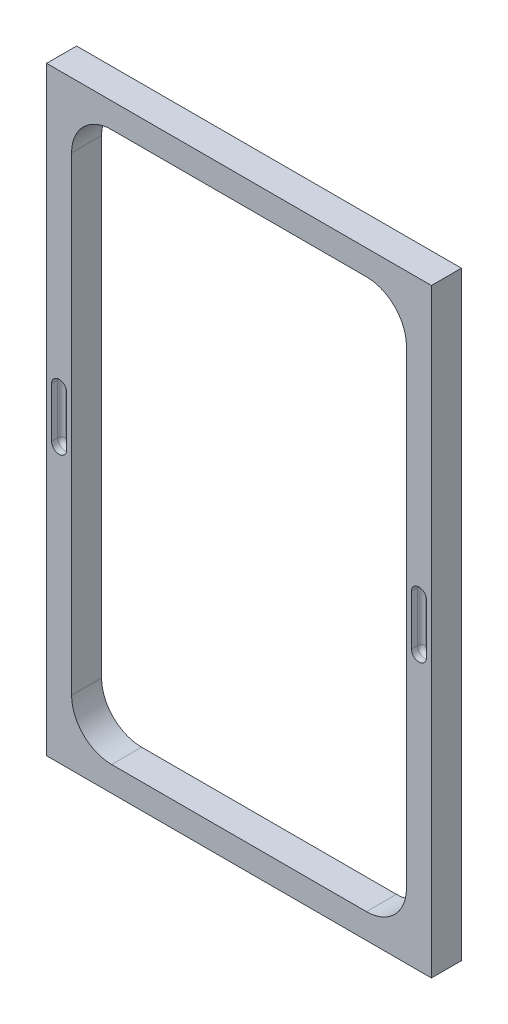
ISO-10303-21;
HEADER;
FILE_DESCRIPTION(('STEP AP214'),'2;1');
FILE_NAME('part.step','',(''),(''),'','','');
FILE_SCHEMA(('AUTOMOTIVE_DESIGN { 1 0 10303 214 1 1 1 1 }'));
ENDSEC;
DATA;
#1=APPLICATION_CONTEXT('core data for automotive mechanical design processes');
#2=APPLICATION_PROTOCOL_DEFINITION('international standard','automotive_design',2000,#1);
#3=PRODUCT_CONTEXT('',#1,'mechanical');
#4=PRODUCT('Part','Part','',(#3));
#5=PRODUCT_RELATED_PRODUCT_CATEGORY('part','',(#4));
#6=PRODUCT_DEFINITION_FORMATION('','',#4);
#7=PRODUCT_DEFINITION_CONTEXT('part definition',#1,'design');
#8=PRODUCT_DEFINITION('design','',#6,#7);
#9=PRODUCT_DEFINITION_SHAPE('','',#8);
#10=(LENGTH_UNIT() NAMED_UNIT(*) SI_UNIT(.MILLI.,.METRE.));
#11=(NAMED_UNIT(*) PLANE_ANGLE_UNIT() SI_UNIT($,.RADIAN.));
#12=(NAMED_UNIT(*) SI_UNIT($,.STERADIAN.) SOLID_ANGLE_UNIT());
#13=UNCERTAINTY_MEASURE_WITH_UNIT(LENGTH_MEASURE(1.E-05),#10,'distance_accuracy_value','');
#14=(GEOMETRIC_REPRESENTATION_CONTEXT(3) GLOBAL_UNCERTAINTY_ASSIGNED_CONTEXT((#13)) GLOBAL_UNIT_ASSIGNED_CONTEXT((#10,
#11,#12)) REPRESENTATION_CONTEXT('',''));
#15=CARTESIAN_POINT('',(0.,0.,0.));
#16=DIRECTION('',(0.,0.,1.));
#17=DIRECTION('',(1.,0.,0.));
#18=AXIS2_PLACEMENT_3D('',#15,#16,#17);
#19=CARTESIAN_POINT('',(0.,0.,76.2));
#20=DIRECTION('',(0.,0.,-1.));
#21=DIRECTION('',(-1.,0.,0.));
#22=AXIS2_PLACEMENT_3D('',#19,#20,#21);
#23=PLANE('',#22);
#24=DIRECTION('',(0.,-1.,0.));
#25=VECTOR('',#24,1.);
#26=CARTESIAN_POINT('',(12.7,825.5,76.2));
#27=LINE('',#26,#25);
#28=CARTESIAN_POINT('',(12.7,825.5,76.2));
#29=VERTEX_POINT('',#28);
#30=CARTESIAN_POINT('',(12.6999999999999,698.5,76.2));
#31=VERTEX_POINT('',#30);
#32=EDGE_CURVE('E202',#29,#31,#27,.T.);
#33=ORIENTED_EDGE('',*,*,#32,.F.);
#34=CARTESIAN_POINT('',(31.7499999999999,825.5,76.2));
#35=DIRECTION('',(0.,0.,1.));
#36=DIRECTION('',(1.,0.,0.));
#37=AXIS2_PLACEMENT_3D('',#34,#35,#36);
#38=CIRCLE('',#37,19.05);
#39=CARTESIAN_POINT('',(50.8,825.5,76.2));
#40=VERTEX_POINT('',#39);
#41=EDGE_CURVE('E207',#40,#29,#38,.T.);
#42=ORIENTED_EDGE('',*,*,#41,.F.);
#43=DIRECTION('',(0.,1.,0.));
#44=VECTOR('',#43,1.);
#45=CARTESIAN_POINT('',(50.8,825.5,76.2));
#46=LINE('',#45,#44);
#47=CARTESIAN_POINT('',(50.8,698.5,76.2));
#48=VERTEX_POINT('',#47);
#49=EDGE_CURVE('E211',#48,#40,#46,.T.);
#50=ORIENTED_EDGE('',*,*,#49,.F.);
#51=CARTESIAN_POINT('',(31.7499999999999,698.5,76.2));
#52=DIRECTION('',(0.,0.,1.));
#53=DIRECTION('',(1.,0.,0.));
#54=AXIS2_PLACEMENT_3D('',#51,#52,#53);
#55=CIRCLE('',#54,19.05);
#56=EDGE_CURVE('E196',#31,#48,#55,.T.);
#57=ORIENTED_EDGE('',*,*,#56,.F.);
#58=EDGE_LOOP('',(#33,#42,#50,#57));
#59=FACE_BOUND('',#58,.T.);
#60=DIRECTION('',(0.,-1.,0.));
#61=VECTOR('',#60,1.);
#62=CARTESIAN_POINT('',(927.1,825.5,76.2));
#63=LINE('',#62,#61);
#64=CARTESIAN_POINT('',(927.1,825.5,76.2));
#65=VERTEX_POINT('',#64);
#66=CARTESIAN_POINT('',(927.1,698.5,76.2));
#67=VERTEX_POINT('',#66);
#68=EDGE_CURVE('E224',#65,#67,#63,.T.);
#69=ORIENTED_EDGE('',*,*,#68,.F.);
#70=CARTESIAN_POINT('',(946.15,825.5,76.2));
#71=DIRECTION('',(0.,0.,1.));
#72=DIRECTION('',(-1.,0.,0.));
#73=AXIS2_PLACEMENT_3D('',#70,#71,#72);
#74=CIRCLE('',#73,19.0500000000001);
#75=CARTESIAN_POINT('',(965.2,825.5,76.2));
#76=VERTEX_POINT('',#75);
#77=EDGE_CURVE('E221',#76,#65,#74,.T.);
#78=ORIENTED_EDGE('',*,*,#77,.F.);
#79=DIRECTION('',(0.,1.,0.));
#80=VECTOR('',#79,1.);
#81=CARTESIAN_POINT('',(965.2,825.5,76.2));
#82=LINE('',#81,#80);
#83=CARTESIAN_POINT('',(965.2,698.5,76.2));
#84=VERTEX_POINT('',#83);
#85=EDGE_CURVE('E231',#84,#76,#82,.T.);
#86=ORIENTED_EDGE('',*,*,#85,.F.);
#87=CARTESIAN_POINT('',(946.15,698.5,76.2));
#88=DIRECTION('',(0.,0.,1.));
#89=DIRECTION('',(-1.,0.,0.));
#90=AXIS2_PLACEMENT_3D('',#87,#88,#89);
#91=CIRCLE('',#90,19.0500000000001);
#92=EDGE_CURVE('E228',#67,#84,#91,.T.);
#93=ORIENTED_EDGE('',*,*,#92,.F.);
#94=EDGE_LOOP('',(#69,#78,#86,#93));
#95=FACE_BOUND('',#94,.T.);
#96=DIRECTION('',(0.,-1.,0.));
#97=VECTOR('',#96,1.);
#98=CARTESIAN_POINT('',(0.,0.,76.2));
#99=LINE('',#98,#97);
#100=CARTESIAN_POINT('',(0.,1524.,76.2));
#101=VERTEX_POINT('',#100);
#102=CARTESIAN_POINT('',(0.,0.,76.2));
#103=VERTEX_POINT('',#102);
#104=EDGE_CURVE('E301',#101,#103,#99,.T.);
#105=ORIENTED_EDGE('',*,*,#104,.T.);
#106=DIRECTION('',(1.,0.,0.));
#107=VECTOR('',#106,1.);
#108=CARTESIAN_POINT('',(0.,0.,76.2));
#109=LINE('',#108,#107);
#110=CARTESIAN_POINT('',(977.9,0.,76.2));
#111=VERTEX_POINT('',#110);
#112=EDGE_CURVE('E304',#103,#111,#109,.T.);
#113=ORIENTED_EDGE('',*,*,#112,.T.);
#114=DIRECTION('',(0.,1.,0.));
#115=VECTOR('',#114,1.);
#116=CARTESIAN_POINT('',(977.9,0.,76.2));
#117=LINE('',#116,#115);
#118=CARTESIAN_POINT('',(977.9,1524.,76.2));
#119=VERTEX_POINT('',#118);
#120=EDGE_CURVE('E307',#111,#119,#117,.T.);
#121=ORIENTED_EDGE('',*,*,#120,.T.);
#122=DIRECTION('',(-1.,0.,0.));
#123=VECTOR('',#122,1.);
#124=CARTESIAN_POINT('',(0.,1524.,76.2));
#125=LINE('',#124,#123);
#126=EDGE_CURVE('E309',#119,#101,#125,.T.);
#127=ORIENTED_EDGE('',*,*,#126,.T.);
#128=EDGE_LOOP('',(#105,#113,#121,#127));
#129=FACE_BOUND('',#128,.T.);
#130=CARTESIAN_POINT('',(165.1,165.1,76.2));
#131=DIRECTION('',(0.,0.,1.));
#132=DIRECTION('',(1.,0.,0.));
#133=AXIS2_PLACEMENT_3D('',#130,#131,#132);
#134=CIRCLE('',#133,101.6);
#135=CARTESIAN_POINT('',(63.5,165.100000000001,76.2));
#136=VERTEX_POINT('',#135);
#137=CARTESIAN_POINT('',(165.100000000001,63.5,76.2));
#138=VERTEX_POINT('',#137);
#139=EDGE_CURVE('E242',#136,#138,#134,.T.);
#140=ORIENTED_EDGE('',*,*,#139,.F.);
#141=DIRECTION('',(0.,-1.,0.));
#142=VECTOR('',#141,1.);
#143=CARTESIAN_POINT('',(63.5,165.100000000001,76.2));
#144=LINE('',#143,#142);
#145=CARTESIAN_POINT('',(63.5,1358.9,76.2));
#146=VERTEX_POINT('',#145);
#147=EDGE_CURVE('E258',#146,#136,#144,.T.);
#148=ORIENTED_EDGE('',*,*,#147,.F.);
#149=CARTESIAN_POINT('',(165.1,1358.9,76.2));
#150=DIRECTION('',(0.,0.,1.));
#151=DIRECTION('',(-1.,0.,0.));
#152=AXIS2_PLACEMENT_3D('',#149,#150,#151);
#153=CIRCLE('',#152,101.6);
#154=CARTESIAN_POINT('',(165.100000000001,1460.5,76.2));
#155=VERTEX_POINT('',#154);
#156=EDGE_CURVE('E255',#155,#146,#153,.T.);
#157=ORIENTED_EDGE('',*,*,#156,.F.);
#158=DIRECTION('',(-1.,0.,0.));
#159=VECTOR('',#158,1.);
#160=CARTESIAN_POINT('',(165.100000000001,1460.5,76.2));
#161=LINE('',#160,#159);
#162=CARTESIAN_POINT('',(812.799999999999,1460.5,76.2));
#163=VERTEX_POINT('',#162);
#164=EDGE_CURVE('E253',#163,#155,#161,.T.);
#165=ORIENTED_EDGE('',*,*,#164,.F.);
#166=CARTESIAN_POINT('',(812.8,1358.9,76.2));
#167=DIRECTION('',(0.,0.,1.));
#168=DIRECTION('',(-1.,0.,0.));
#169=AXIS2_PLACEMENT_3D('',#166,#167,#168);
#170=CIRCLE('',#169,101.6);
#171=CARTESIAN_POINT('',(914.4,1358.9,76.2));
#172=VERTEX_POINT('',#171);
#173=EDGE_CURVE('E251',#172,#163,#170,.T.);
#174=ORIENTED_EDGE('',*,*,#173,.F.);
#175=DIRECTION('',(0.,1.,0.));
#176=VECTOR('',#175,1.);
#177=CARTESIAN_POINT('',(914.4,165.100000000001,76.2));
#178=LINE('',#177,#176);
#179=CARTESIAN_POINT('',(914.4,165.100000000001,76.2));
#180=VERTEX_POINT('',#179);
#181=EDGE_CURVE('E249',#180,#172,#178,.T.);
#182=ORIENTED_EDGE('',*,*,#181,.F.);
#183=CARTESIAN_POINT('',(812.8,165.1,76.2));
#184=DIRECTION('',(0.,0.,1.));
#185=DIRECTION('',(-1.,0.,0.));
#186=AXIS2_PLACEMENT_3D('',#183,#184,#185);
#187=CIRCLE('',#186,101.6);
#188=CARTESIAN_POINT('',(812.799999999999,63.5,76.2));
#189=VERTEX_POINT('',#188);
#190=EDGE_CURVE('E247',#189,#180,#187,.T.);
#191=ORIENTED_EDGE('',*,*,#190,.F.);
#192=DIRECTION('',(1.,0.,0.));
#193=VECTOR('',#192,1.);
#194=CARTESIAN_POINT('',(165.100000000001,63.5,76.2));
#195=LINE('',#194,#193);
#196=EDGE_CURVE('E244',#138,#189,#195,.T.);
#197=ORIENTED_EDGE('',*,*,#196,.F.);
#198=EDGE_LOOP('',(#140,#148,#157,#165,#174,#182,#191,#197));
#199=FACE_BOUND('',#198,.T.);
#200=ADVANCED_FACE('F32',(#59,#95,#129,#199),#23,.F.);
#201=CARTESIAN_POINT('',(0.,0.,0.));
#202=DIRECTION('',(0.,0.,-1.));
#203=DIRECTION('',(-1.,0.,0.));
#204=AXIS2_PLACEMENT_3D('',#201,#202,#203);
#205=PLANE('',#204);
#206=DIRECTION('',(0.,-1.,0.));
#207=VECTOR('',#206,1.);
#208=CARTESIAN_POINT('',(0.,0.,0.));
#209=LINE('',#208,#207);
#210=CARTESIAN_POINT('',(0.,1524.,0.));
#211=VERTEX_POINT('',#210);
#212=CARTESIAN_POINT('',(0.,0.,0.));
#213=VERTEX_POINT('',#212);
#214=EDGE_CURVE('E300',#211,#213,#209,.T.);
#215=ORIENTED_EDGE('',*,*,#214,.F.);
#216=DIRECTION('',(-1.,0.,0.));
#217=VECTOR('',#216,1.);
#218=CARTESIAN_POINT('',(0.,1524.,0.));
#219=LINE('',#218,#217);
#220=CARTESIAN_POINT('',(977.9,1524.,0.));
#221=VERTEX_POINT('',#220);
#222=EDGE_CURVE('E305',#221,#211,#219,.T.);
#223=ORIENTED_EDGE('',*,*,#222,.F.);
#224=DIRECTION('',(0.,1.,0.));
#225=VECTOR('',#224,1.);
#226=CARTESIAN_POINT('',(977.9,0.,0.));
#227=LINE('',#226,#225);
#228=CARTESIAN_POINT('',(977.9,0.,0.));
#229=VERTEX_POINT('',#228);
#230=EDGE_CURVE('E316',#229,#221,#227,.T.);
#231=ORIENTED_EDGE('',*,*,#230,.F.);
#232=DIRECTION('',(1.,0.,0.));
#233=VECTOR('',#232,1.);
#234=CARTESIAN_POINT('',(0.,0.,0.));
#235=LINE('',#234,#233);
#236=EDGE_CURVE('E314',#213,#229,#235,.T.);
#237=ORIENTED_EDGE('',*,*,#236,.F.);
#238=EDGE_LOOP('',(#215,#223,#231,#237));
#239=FACE_BOUND('',#238,.T.);
#240=DIRECTION('',(0.,-1.,0.));
#241=VECTOR('',#240,1.);
#242=CARTESIAN_POINT('',(63.5,165.100000000001,0.));
#243=LINE('',#242,#241);
#244=CARTESIAN_POINT('',(63.5,1358.9,0.));
#245=VERTEX_POINT('',#244);
#246=CARTESIAN_POINT('',(63.5,165.100000000001,0.));
#247=VERTEX_POINT('',#246);
#248=EDGE_CURVE('E245',#245,#247,#243,.T.);
#249=ORIENTED_EDGE('',*,*,#248,.T.);
#250=CARTESIAN_POINT('',(165.1,165.1,0.));
#251=DIRECTION('',(0.,0.,1.));
#252=DIRECTION('',(1.,0.,0.));
#253=AXIS2_PLACEMENT_3D('',#250,#251,#252);
#254=CIRCLE('',#253,101.6);
#255=CARTESIAN_POINT('',(165.100000000001,63.5,0.));
#256=VERTEX_POINT('',#255);
#257=EDGE_CURVE('E218',#247,#256,#254,.T.);
#258=ORIENTED_EDGE('',*,*,#257,.T.);
#259=DIRECTION('',(1.,0.,0.));
#260=VECTOR('',#259,1.);
#261=CARTESIAN_POINT('',(165.100000000001,63.5,0.));
#262=LINE('',#261,#260);
#263=CARTESIAN_POINT('',(812.799999999999,63.5,0.));
#264=VERTEX_POINT('',#263);
#265=EDGE_CURVE('E263',#256,#264,#262,.T.);
#266=ORIENTED_EDGE('',*,*,#265,.T.);
#267=CARTESIAN_POINT('',(812.8,165.1,0.));
#268=DIRECTION('',(0.,0.,1.));
#269=DIRECTION('',(-1.,0.,0.));
#270=AXIS2_PLACEMENT_3D('',#267,#268,#269);
#271=CIRCLE('',#270,101.6);
#272=CARTESIAN_POINT('',(914.4,165.100000000001,0.));
#273=VERTEX_POINT('',#272);
#274=EDGE_CURVE('E266',#264,#273,#271,.T.);
#275=ORIENTED_EDGE('',*,*,#274,.T.);
#276=DIRECTION('',(0.,1.,0.));
#277=VECTOR('',#276,1.);
#278=CARTESIAN_POINT('',(914.4,165.100000000001,0.));
#279=LINE('',#278,#277);
#280=CARTESIAN_POINT('',(914.4,1358.9,0.));
#281=VERTEX_POINT('',#280);
#282=EDGE_CURVE('E269',#273,#281,#279,.T.);
#283=ORIENTED_EDGE('',*,*,#282,.T.);
#284=CARTESIAN_POINT('',(812.8,1358.9,0.));
#285=DIRECTION('',(0.,0.,1.));
#286=DIRECTION('',(-1.,0.,0.));
#287=AXIS2_PLACEMENT_3D('',#284,#285,#286);
#288=CIRCLE('',#287,101.6);
#289=CARTESIAN_POINT('',(812.799999999999,1460.5,0.));
#290=VERTEX_POINT('',#289);
#291=EDGE_CURVE('E272',#281,#290,#288,.T.);
#292=ORIENTED_EDGE('',*,*,#291,.T.);
#293=DIRECTION('',(-1.,0.,0.));
#294=VECTOR('',#293,1.);
#295=CARTESIAN_POINT('',(165.100000000001,1460.5,0.));
#296=LINE('',#295,#294);
#297=CARTESIAN_POINT('',(165.100000000001,1460.5,0.));
#298=VERTEX_POINT('',#297);
#299=EDGE_CURVE('E275',#290,#298,#296,.T.);
#300=ORIENTED_EDGE('',*,*,#299,.T.);
#301=CARTESIAN_POINT('',(165.1,1358.9,0.));
#302=DIRECTION('',(0.,0.,1.));
#303=DIRECTION('',(-1.,0.,0.));
#304=AXIS2_PLACEMENT_3D('',#301,#302,#303);
#305=CIRCLE('',#304,101.6);
#306=EDGE_CURVE('E278',#298,#245,#305,.T.);
#307=ORIENTED_EDGE('',*,*,#306,.T.);
#308=EDGE_LOOP('',(#249,#258,#266,#275,#283,#292,#300,#307));
#309=FACE_BOUND('',#308,.T.);
#310=ADVANCED_FACE('F414',(#239,#309),#205,.T.);
#311=CARTESIAN_POINT('',(0.,0.,76.2));
#312=DIRECTION('',(1.,0.,0.));
#313=DIRECTION('',(0.,0.,-1.));
#314=AXIS2_PLACEMENT_3D('',#311,#312,#313);
#315=PLANE('',#314);
#316=ORIENTED_EDGE('',*,*,#214,.T.);
#317=DIRECTION('',(0.,0.,-1.));
#318=VECTOR('',#317,1.);
#319=CARTESIAN_POINT('',(0.,0.,76.2));
#320=LINE('',#319,#318);
#321=EDGE_CURVE('E327',#103,#213,#320,.T.);
#322=ORIENTED_EDGE('',*,*,#321,.F.);
#323=ORIENTED_EDGE('',*,*,#104,.F.);
#324=DIRECTION('',(0.,0.,-1.));
#325=VECTOR('',#324,1.);
#326=CARTESIAN_POINT('',(0.,1524.,76.2));
#327=LINE('',#326,#325);
#328=EDGE_CURVE('E311',#101,#211,#327,.T.);
#329=ORIENTED_EDGE('',*,*,#328,.T.);
#330=EDGE_LOOP('',(#316,#322,#323,#329));
#331=FACE_BOUND('',#330,.T.);
#332=ADVANCED_FACE('F419',(#331),#315,.F.);
#333=CARTESIAN_POINT('',(0.,0.,76.2));
#334=DIRECTION('',(0.,1.,0.));
#335=DIRECTION('',(0.,0.,1.));
#336=AXIS2_PLACEMENT_3D('',#333,#334,#335);
#337=PLANE('',#336);
#338=ORIENTED_EDGE('',*,*,#236,.T.);
#339=DIRECTION('',(0.,0.,-1.));
#340=VECTOR('',#339,1.);
#341=CARTESIAN_POINT('',(977.9,0.,76.2));
#342=LINE('',#341,#340);
#343=EDGE_CURVE('E324',#111,#229,#342,.T.);
#344=ORIENTED_EDGE('',*,*,#343,.F.);
#345=ORIENTED_EDGE('',*,*,#112,.F.);
#346=ORIENTED_EDGE('',*,*,#321,.T.);
#347=EDGE_LOOP('',(#338,#344,#345,#346));
#348=FACE_BOUND('',#347,.T.);
#349=ADVANCED_FACE('F433',(#348),#337,.F.);
#350=CARTESIAN_POINT('',(977.9,0.,76.2));
#351=DIRECTION('',(-1.,0.,0.));
#352=DIRECTION('',(0.,0.,1.));
#353=AXIS2_PLACEMENT_3D('',#350,#351,#352);
#354=PLANE('',#353);
#355=ORIENTED_EDGE('',*,*,#230,.T.);
#356=DIRECTION('',(0.,0.,-1.));
#357=VECTOR('',#356,1.);
#358=CARTESIAN_POINT('',(977.9,1524.,76.2));
#359=LINE('',#358,#357);
#360=EDGE_CURVE('E321',#119,#221,#359,.T.);
#361=ORIENTED_EDGE('',*,*,#360,.F.);
#362=ORIENTED_EDGE('',*,*,#120,.F.);
#363=ORIENTED_EDGE('',*,*,#343,.T.);
#364=EDGE_LOOP('',(#355,#361,#362,#363));
#365=FACE_BOUND('',#364,.T.);
#366=ADVANCED_FACE('F429',(#365),#354,.F.);
#367=CARTESIAN_POINT('',(0.,1524.,76.2));
#368=DIRECTION('',(0.,-1.,0.));
#369=DIRECTION('',(0.,0.,-1.));
#370=AXIS2_PLACEMENT_3D('',#367,#368,#369);
#371=PLANE('',#370);
#372=ORIENTED_EDGE('',*,*,#222,.T.);
#373=ORIENTED_EDGE('',*,*,#328,.F.);
#374=ORIENTED_EDGE('',*,*,#126,.F.);
#375=ORIENTED_EDGE('',*,*,#360,.T.);
#376=EDGE_LOOP('',(#372,#373,#374,#375));
#377=FACE_BOUND('',#376,.T.);
#378=ADVANCED_FACE('F426',(#377),#371,.F.);
#379=CARTESIAN_POINT('',(165.1,165.1,76.2));
#380=DIRECTION('',(0.,0.,-1.));
#381=DIRECTION('',(-1.,0.,0.));
#382=AXIS2_PLACEMENT_3D('',#379,#380,#381);
#383=CYLINDRICAL_SURFACE('',#382,101.6);
#384=ORIENTED_EDGE('',*,*,#257,.F.);
#385=DIRECTION('',(0.,0.,-1.));
#386=VECTOR('',#385,1.);
#387=CARTESIAN_POINT('',(63.5,165.100000000001,76.2));
#388=LINE('',#387,#386);
#389=EDGE_CURVE('E260',#136,#247,#388,.T.);
#390=ORIENTED_EDGE('',*,*,#389,.F.);
#391=ORIENTED_EDGE('',*,*,#139,.T.);
#392=DIRECTION('',(0.,0.,-1.));
#393=VECTOR('',#392,1.);
#394=CARTESIAN_POINT('',(165.100000000001,63.5,76.2));
#395=LINE('',#394,#393);
#396=EDGE_CURVE('E297',#138,#256,#395,.T.);
#397=ORIENTED_EDGE('',*,*,#396,.T.);
#398=EDGE_LOOP('',(#384,#390,#391,#397));
#399=FACE_BOUND('',#398,.T.);
#400=ADVANCED_FACE('F423',(#399),#383,.F.);
#401=CARTESIAN_POINT('',(165.100000000001,63.5,76.2));
#402=DIRECTION('',(0.,1.,0.));
#403=DIRECTION('',(0.,0.,1.));
#404=AXIS2_PLACEMENT_3D('',#401,#402,#403);
#405=PLANE('',#404);
#406=ORIENTED_EDGE('',*,*,#265,.F.);
#407=ORIENTED_EDGE('',*,*,#396,.F.);
#408=ORIENTED_EDGE('',*,*,#196,.T.);
#409=DIRECTION('',(0.,0.,-1.));
#410=VECTOR('',#409,1.);
#411=CARTESIAN_POINT('',(812.799999999999,63.5,76.2));
#412=LINE('',#411,#410);
#413=EDGE_CURVE('E295',#189,#264,#412,.T.);
#414=ORIENTED_EDGE('',*,*,#413,.T.);
#415=EDGE_LOOP('',(#406,#407,#408,#414));
#416=FACE_BOUND('',#415,.T.);
#417=ADVANCED_FACE('F625',(#416),#405,.T.);
#418=CARTESIAN_POINT('',(812.8,165.1,76.2));
#419=DIRECTION('',(0.,0.,-1.));
#420=DIRECTION('',(-1.,0.,0.));
#421=AXIS2_PLACEMENT_3D('',#418,#419,#420);
#422=CYLINDRICAL_SURFACE('',#421,101.6);
#423=ORIENTED_EDGE('',*,*,#274,.F.);
#424=ORIENTED_EDGE('',*,*,#413,.F.);
#425=ORIENTED_EDGE('',*,*,#190,.T.);
#426=DIRECTION('',(0.,0.,-1.));
#427=VECTOR('',#426,1.);
#428=CARTESIAN_POINT('',(914.4,165.100000000001,76.2));
#429=LINE('',#428,#427);
#430=EDGE_CURVE('E293',#180,#273,#429,.T.);
#431=ORIENTED_EDGE('',*,*,#430,.T.);
#432=EDGE_LOOP('',(#423,#424,#425,#431));
#433=FACE_BOUND('',#432,.T.);
#434=ADVANCED_FACE('F615',(#433),#422,.F.);
#435=CARTESIAN_POINT('',(914.4,165.100000000001,76.2));
#436=DIRECTION('',(-1.,0.,0.));
#437=DIRECTION('',(0.,0.,1.));
#438=AXIS2_PLACEMENT_3D('',#435,#436,#437);
#439=PLANE('',#438);
#440=ORIENTED_EDGE('',*,*,#282,.F.);
#441=ORIENTED_EDGE('',*,*,#430,.F.);
#442=ORIENTED_EDGE('',*,*,#181,.T.);
#443=DIRECTION('',(0.,0.,-1.));
#444=VECTOR('',#443,1.);
#445=CARTESIAN_POINT('',(914.4,1358.9,76.2));
#446=LINE('',#445,#444);
#447=EDGE_CURVE('E291',#172,#281,#446,.T.);
#448=ORIENTED_EDGE('',*,*,#447,.T.);
#449=EDGE_LOOP('',(#440,#441,#442,#448));
#450=FACE_BOUND('',#449,.T.);
#451=ADVANCED_FACE('F605',(#450),#439,.T.);
#452=CARTESIAN_POINT('',(812.8,1358.9,76.2));
#453=DIRECTION('',(0.,0.,-1.));
#454=DIRECTION('',(-1.,0.,0.));
#455=AXIS2_PLACEMENT_3D('',#452,#453,#454);
#456=CYLINDRICAL_SURFACE('',#455,101.6);
#457=ORIENTED_EDGE('',*,*,#291,.F.);
#458=ORIENTED_EDGE('',*,*,#447,.F.);
#459=ORIENTED_EDGE('',*,*,#173,.T.);
#460=DIRECTION('',(0.,0.,-1.));
#461=VECTOR('',#460,1.);
#462=CARTESIAN_POINT('',(812.799999999999,1460.5,76.2));
#463=LINE('',#462,#461);
#464=EDGE_CURVE('E289',#163,#290,#463,.T.);
#465=ORIENTED_EDGE('',*,*,#464,.T.);
#466=EDGE_LOOP('',(#457,#458,#459,#465));
#467=FACE_BOUND('',#466,.T.);
#468=ADVANCED_FACE('F595',(#467),#456,.F.);
#469=CARTESIAN_POINT('',(165.100000000001,1460.5,76.2));
#470=DIRECTION('',(0.,-1.,0.));
#471=DIRECTION('',(0.,0.,-1.));
#472=AXIS2_PLACEMENT_3D('',#469,#470,#471);
#473=PLANE('',#472);
#474=ORIENTED_EDGE('',*,*,#299,.F.);
#475=ORIENTED_EDGE('',*,*,#464,.F.);
#476=ORIENTED_EDGE('',*,*,#164,.T.);
#477=DIRECTION('',(0.,0.,-1.));
#478=VECTOR('',#477,1.);
#479=CARTESIAN_POINT('',(165.100000000001,1460.5,76.2));
#480=LINE('',#479,#478);
#481=EDGE_CURVE('E287',#155,#298,#480,.T.);
#482=ORIENTED_EDGE('',*,*,#481,.T.);
#483=EDGE_LOOP('',(#474,#475,#476,#482));
#484=FACE_BOUND('',#483,.T.);
#485=ADVANCED_FACE('F585',(#484),#473,.T.);
#486=CARTESIAN_POINT('',(165.1,1358.9,76.2));
#487=DIRECTION('',(0.,0.,-1.));
#488=DIRECTION('',(-1.,0.,0.));
#489=AXIS2_PLACEMENT_3D('',#486,#487,#488);
#490=CYLINDRICAL_SURFACE('',#489,101.6);
#491=ORIENTED_EDGE('',*,*,#306,.F.);
#492=ORIENTED_EDGE('',*,*,#481,.F.);
#493=ORIENTED_EDGE('',*,*,#156,.T.);
#494=DIRECTION('',(0.,0.,-1.));
#495=VECTOR('',#494,1.);
#496=CARTESIAN_POINT('',(63.5,1358.9,76.2));
#497=LINE('',#496,#495);
#498=EDGE_CURVE('E285',#146,#245,#497,.T.);
#499=ORIENTED_EDGE('',*,*,#498,.T.);
#500=EDGE_LOOP('',(#491,#492,#493,#499));
#501=FACE_BOUND('',#500,.T.);
#502=ADVANCED_FACE('F575',(#501),#490,.F.);
#503=CARTESIAN_POINT('',(63.5,165.100000000001,76.2));
#504=DIRECTION('',(1.,0.,0.));
#505=DIRECTION('',(0.,0.,-1.));
#506=AXIS2_PLACEMENT_3D('',#503,#504,#505);
#507=PLANE('',#506);
#508=ORIENTED_EDGE('',*,*,#248,.F.);
#509=ORIENTED_EDGE('',*,*,#498,.F.);
#510=ORIENTED_EDGE('',*,*,#147,.T.);
#511=ORIENTED_EDGE('',*,*,#389,.T.);
#512=EDGE_LOOP('',(#508,#509,#510,#511));
#513=FACE_BOUND('',#512,.T.);
#514=ADVANCED_FACE('F559',(#513),#507,.T.);
#515=CARTESIAN_POINT('',(946.15,825.5,50.8));
#516=DIRECTION('',(0.,0.,1.));
#517=DIRECTION('',(1.,0.,0.));
#518=AXIS2_PLACEMENT_3D('',#515,#516,#517);
#519=CYLINDRICAL_SURFACE('',#518,19.0500000000001);
#520=DIRECTION('',(0.,0.,1.));
#521=VECTOR('',#520,1.);
#522=CARTESIAN_POINT('',(927.1,825.5,50.8));
#523=LINE('',#522,#521);
#524=CARTESIAN_POINT('',(927.1,825.5,60.96));
#525=VERTEX_POINT('',#524);
#526=EDGE_CURVE('E234',#525,#65,#523,.T.);
#527=ORIENTED_EDGE('',*,*,#526,.F.);
#528=CARTESIAN_POINT('',(946.15,825.5,60.96));
#529=DIRECTION('',(0.,0.,-1.));
#530=DIRECTION('',(-1.,0.,0.));
#531=AXIS2_PLACEMENT_3D('',#528,#529,#530);
#532=CIRCLE('',#531,19.0500000000001);
#533=CARTESIAN_POINT('',(965.2,825.5,60.96));
#534=VERTEX_POINT('',#533);
#535=EDGE_CURVE('E346',#525,#534,#532,.T.);
#536=ORIENTED_EDGE('',*,*,#535,.T.);
#537=DIRECTION('',(0.,0.,1.));
#538=VECTOR('',#537,1.);
#539=CARTESIAN_POINT('',(965.2,825.5,50.8));
#540=LINE('',#539,#538);
#541=EDGE_CURVE('E235',#534,#76,#540,.T.);
#542=ORIENTED_EDGE('',*,*,#541,.T.);
#543=ORIENTED_EDGE('',*,*,#77,.T.);
#544=EDGE_LOOP('',(#527,#536,#542,#543));
#545=FACE_BOUND('',#544,.T.);
#546=ADVANCED_FACE('F550',(#545),#519,.F.);
#547=CARTESIAN_POINT('',(965.2,825.5,50.8));
#548=DIRECTION('',(1.,0.,0.));
#549=DIRECTION('',(0.,0.,-1.));
#550=AXIS2_PLACEMENT_3D('',#547,#548,#549);
#551=PLANE('',#550);
#552=ORIENTED_EDGE('',*,*,#541,.F.);
#553=DIRECTION('',(0.,1.,0.));
#554=VECTOR('',#553,1.);
#555=CARTESIAN_POINT('',(965.2,698.5,60.96));
#556=LINE('',#555,#554);
#557=CARTESIAN_POINT('',(965.2,698.5,60.96));
#558=VERTEX_POINT('',#557);
#559=EDGE_CURVE('E339',#534,#558,#556,.F.);
#560=ORIENTED_EDGE('',*,*,#559,.T.);
#561=DIRECTION('',(0.,0.,1.));
#562=VECTOR('',#561,1.);
#563=CARTESIAN_POINT('',(965.2,698.5,50.8));
#564=LINE('',#563,#562);
#565=EDGE_CURVE('E237',#558,#84,#564,.T.);
#566=ORIENTED_EDGE('',*,*,#565,.T.);
#567=ORIENTED_EDGE('',*,*,#85,.T.);
#568=EDGE_LOOP('',(#552,#560,#566,#567));
#569=FACE_BOUND('',#568,.T.);
#570=ADVANCED_FACE('F540',(#569),#551,.F.);
#571=CARTESIAN_POINT('',(946.15,698.5,50.8));
#572=DIRECTION('',(0.,0.,1.));
#573=DIRECTION('',(1.,0.,0.));
#574=AXIS2_PLACEMENT_3D('',#571,#572,#573);
#575=CYLINDRICAL_SURFACE('',#574,19.0500000000001);
#576=ORIENTED_EDGE('',*,*,#565,.F.);
#577=CARTESIAN_POINT('',(946.15,698.5,60.96));
#578=DIRECTION('',(0.,0.,-1.));
#579=DIRECTION('',(-1.,0.,0.));
#580=AXIS2_PLACEMENT_3D('',#577,#578,#579);
#581=CIRCLE('',#580,19.0500000000001);
#582=CARTESIAN_POINT('',(927.1,698.5,60.96));
#583=VERTEX_POINT('',#582);
#584=EDGE_CURVE('E342',#558,#583,#581,.T.);
#585=ORIENTED_EDGE('',*,*,#584,.T.);
#586=DIRECTION('',(0.,0.,1.));
#587=VECTOR('',#586,1.);
#588=CARTESIAN_POINT('',(927.1,698.5,50.8));
#589=LINE('',#588,#587);
#590=EDGE_CURVE('E239',#583,#67,#589,.T.);
#591=ORIENTED_EDGE('',*,*,#590,.T.);
#592=ORIENTED_EDGE('',*,*,#92,.T.);
#593=EDGE_LOOP('',(#576,#585,#591,#592));
#594=FACE_BOUND('',#593,.T.);
#595=ADVANCED_FACE('F530',(#594),#575,.F.);
#596=CARTESIAN_POINT('',(927.1,825.5,50.8));
#597=DIRECTION('',(-1.,0.,0.));
#598=DIRECTION('',(0.,0.,1.));
#599=AXIS2_PLACEMENT_3D('',#596,#597,#598);
#600=PLANE('',#599);
#601=ORIENTED_EDGE('',*,*,#590,.F.);
#602=DIRECTION('',(0.,-1.,0.));
#603=VECTOR('',#602,1.);
#604=CARTESIAN_POINT('',(927.1,825.5,60.96));
#605=LINE('',#604,#603);
#606=EDGE_CURVE('E344',#583,#525,#605,.F.);
#607=ORIENTED_EDGE('',*,*,#606,.T.);
#608=ORIENTED_EDGE('',*,*,#526,.T.);
#609=ORIENTED_EDGE('',*,*,#68,.T.);
#610=EDGE_LOOP('',(#601,#607,#608,#609));
#611=FACE_BOUND('',#610,.T.);
#612=ADVANCED_FACE('F520',(#611),#600,.F.);
#613=CARTESIAN_POINT('',(946.15,825.5,50.8));
#614=DIRECTION('',(0.,0.,-1.));
#615=DIRECTION('',(-1.,0.,0.));
#616=AXIS2_PLACEMENT_3D('',#613,#614,#615);
#617=PLANE('',#616);
#618=CARTESIAN_POINT('',(946.15,698.5,50.8));
#619=DIRECTION('',(0.,0.,-1.));
#620=DIRECTION('',(-1.,0.,0.));
#621=AXIS2_PLACEMENT_3D('',#618,#619,#620);
#622=CIRCLE('',#621,8.89000000000007);
#623=CARTESIAN_POINT('',(937.26,698.5,50.8));
#624=VERTEX_POINT('',#623);
#625=CARTESIAN_POINT('',(955.04,698.5,50.8));
#626=VERTEX_POINT('',#625);
#627=EDGE_CURVE('E334',#624,#626,#622,.F.);
#628=ORIENTED_EDGE('',*,*,#627,.T.);
#629=DIRECTION('',(0.,1.,0.));
#630=VECTOR('',#629,1.);
#631=CARTESIAN_POINT('',(955.04,825.5,50.8));
#632=LINE('',#631,#630);
#633=CARTESIAN_POINT('',(955.04,825.5,50.8));
#634=VERTEX_POINT('',#633);
#635=EDGE_CURVE('E336',#626,#634,#632,.T.);
#636=ORIENTED_EDGE('',*,*,#635,.T.);
#637=CARTESIAN_POINT('',(946.15,825.5,50.8));
#638=DIRECTION('',(0.,0.,-1.));
#639=DIRECTION('',(-1.,0.,0.));
#640=AXIS2_PLACEMENT_3D('',#637,#638,#639);
#641=CIRCLE('',#640,8.89000000000007);
#642=CARTESIAN_POINT('',(937.26,825.5,50.8));
#643=VERTEX_POINT('',#642);
#644=EDGE_CURVE('E330',#634,#643,#641,.F.);
#645=ORIENTED_EDGE('',*,*,#644,.T.);
#646=DIRECTION('',(0.,-1.,0.));
#647=VECTOR('',#646,1.);
#648=CARTESIAN_POINT('',(937.26,698.5,50.8));
#649=LINE('',#648,#647);
#650=EDGE_CURVE('E332',#643,#624,#649,.T.);
#651=ORIENTED_EDGE('',*,*,#650,.T.);
#652=EDGE_LOOP('',(#628,#636,#645,#651));
#653=FACE_BOUND('',#652,.T.);
#654=ADVANCED_FACE('F511',(#653),#617,.F.);
#655=CARTESIAN_POINT('',(31.7499999999999,825.5,50.8));
#656=DIRECTION('',(0.,0.,1.));
#657=DIRECTION('',(1.,0.,0.));
#658=AXIS2_PLACEMENT_3D('',#655,#656,#657);
#659=CYLINDRICAL_SURFACE('',#658,19.05);
#660=DIRECTION('',(0.,0.,1.));
#661=VECTOR('',#660,1.);
#662=CARTESIAN_POINT('',(12.7,825.5,50.8));
#663=LINE('',#662,#661);
#664=CARTESIAN_POINT('',(12.7,825.5,60.96));
#665=VERTEX_POINT('',#664);
#666=EDGE_CURVE('E199',#665,#29,#663,.T.);
#667=ORIENTED_EDGE('',*,*,#666,.F.);
#668=CARTESIAN_POINT('',(31.7499999999999,825.5,60.96));
#669=DIRECTION('',(0.,0.,1.));
#670=DIRECTION('',(1.,0.,0.));
#671=AXIS2_PLACEMENT_3D('',#668,#669,#670);
#672=CIRCLE('',#671,19.05);
#673=CARTESIAN_POINT('',(50.8,825.5,60.96));
#674=VERTEX_POINT('',#673);
#675=EDGE_CURVE('E11',#665,#674,#672,.F.);
#676=ORIENTED_EDGE('',*,*,#675,.T.);
#677=DIRECTION('',(0.,0.,1.));
#678=VECTOR('',#677,1.);
#679=CARTESIAN_POINT('',(50.8,825.5,50.8));
#680=LINE('',#679,#678);
#681=EDGE_CURVE('E216',#674,#40,#680,.T.);
#682=ORIENTED_EDGE('',*,*,#681,.T.);
#683=ORIENTED_EDGE('',*,*,#41,.T.);
#684=EDGE_LOOP('',(#667,#676,#682,#683));
#685=FACE_BOUND('',#684,.T.);
#686=ADVANCED_FACE('F392',(#685),#659,.F.);
#687=CARTESIAN_POINT('',(50.8,825.5,50.8));
#688=DIRECTION('',(1.,0.,0.));
#689=DIRECTION('',(0.,0.,-1.));
#690=AXIS2_PLACEMENT_3D('',#687,#688,#689);
#691=PLANE('',#690);
#692=ORIENTED_EDGE('',*,*,#681,.F.);
#693=DIRECTION('',(0.,1.,0.));
#694=VECTOR('',#693,1.);
#695=CARTESIAN_POINT('',(50.8,825.5,60.96));
#696=LINE('',#695,#694);
#697=CARTESIAN_POINT('',(50.8,698.5,60.96));
#698=VERTEX_POINT('',#697);
#699=EDGE_CURVE('E357',#674,#698,#696,.F.);
#700=ORIENTED_EDGE('',*,*,#699,.T.);
#701=DIRECTION('',(0.,0.,1.));
#702=VECTOR('',#701,1.);
#703=CARTESIAN_POINT('',(50.8,698.5,50.8));
#704=LINE('',#703,#702);
#705=EDGE_CURVE('E198',#698,#48,#704,.T.);
#706=ORIENTED_EDGE('',*,*,#705,.T.);
#707=ORIENTED_EDGE('',*,*,#49,.T.);
#708=EDGE_LOOP('',(#692,#700,#706,#707));
#709=FACE_BOUND('',#708,.T.);
#710=ADVANCED_FACE('F395',(#709),#691,.F.);
#711=CARTESIAN_POINT('',(31.7499999999999,698.5,50.8));
#712=DIRECTION('',(0.,0.,1.));
#713=DIRECTION('',(1.,0.,0.));
#714=AXIS2_PLACEMENT_3D('',#711,#712,#713);
#715=CYLINDRICAL_SURFACE('',#714,19.05);
#716=ORIENTED_EDGE('',*,*,#705,.F.);
#717=CARTESIAN_POINT('',(31.7499999999999,698.5,60.96));
#718=DIRECTION('',(0.,0.,1.));
#719=DIRECTION('',(1.,0.,0.));
#720=AXIS2_PLACEMENT_3D('',#717,#718,#719);
#721=CIRCLE('',#720,19.05);
#722=CARTESIAN_POINT('',(12.6999999999999,698.5,60.96));
#723=VERTEX_POINT('',#722);
#724=EDGE_CURVE('E56',#698,#723,#721,.F.);
#725=ORIENTED_EDGE('',*,*,#724,.T.);
#726=DIRECTION('',(0.,0.,1.));
#727=VECTOR('',#726,1.);
#728=CARTESIAN_POINT('',(12.6999999999999,698.5,50.8));
#729=LINE('',#728,#727);
#730=EDGE_CURVE('E192',#723,#31,#729,.T.);
#731=ORIENTED_EDGE('',*,*,#730,.T.);
#732=ORIENTED_EDGE('',*,*,#56,.T.);
#733=EDGE_LOOP('',(#716,#725,#731,#732));
#734=FACE_BOUND('',#733,.T.);
#735=ADVANCED_FACE('F194',(#734),#715,.F.);
#736=CARTESIAN_POINT('',(12.7,825.5,50.8));
#737=DIRECTION('',(-1.,0.,0.));
#738=DIRECTION('',(0.,0.,1.));
#739=AXIS2_PLACEMENT_3D('',#736,#737,#738);
#740=PLANE('',#739);
#741=ORIENTED_EDGE('',*,*,#730,.F.);
#742=DIRECTION('',(0.,-1.,0.));
#743=VECTOR('',#742,1.);
#744=CARTESIAN_POINT('',(12.7,825.5,60.96));
#745=LINE('',#744,#743);
#746=EDGE_CURVE('E41',#723,#665,#745,.F.);
#747=ORIENTED_EDGE('',*,*,#746,.T.);
#748=ORIENTED_EDGE('',*,*,#666,.T.);
#749=ORIENTED_EDGE('',*,*,#32,.T.);
#750=EDGE_LOOP('',(#741,#747,#748,#749));
#751=FACE_BOUND('',#750,.T.);
#752=ADVANCED_FACE('F203',(#751),#740,.F.);
#753=CARTESIAN_POINT('',(31.7499999999999,825.5,50.8));
#754=DIRECTION('',(0.,0.,1.));
#755=DIRECTION('',(1.,0.,0.));
#756=AXIS2_PLACEMENT_3D('',#753,#754,#755);
#757=PLANE('',#756);
#758=CARTESIAN_POINT('',(31.7499999999999,698.5,50.8));
#759=DIRECTION('',(0.,0.,1.));
#760=DIRECTION('',(1.,0.,0.));
#761=AXIS2_PLACEMENT_3D('',#758,#759,#760);
#762=CIRCLE('',#761,8.89000000000002);
#763=CARTESIAN_POINT('',(22.86,698.5,50.8));
#764=VERTEX_POINT('',#763);
#765=CARTESIAN_POINT('',(40.64,698.5,50.8));
#766=VERTEX_POINT('',#765);
#767=EDGE_CURVE('E352',#764,#766,#762,.T.);
#768=ORIENTED_EDGE('',*,*,#767,.T.);
#769=DIRECTION('',(0.,1.,0.));
#770=VECTOR('',#769,1.);
#771=CARTESIAN_POINT('',(40.64,825.5,50.8));
#772=LINE('',#771,#770);
#773=CARTESIAN_POINT('',(40.64,825.5,50.8));
#774=VERTEX_POINT('',#773);
#775=EDGE_CURVE('E354',#766,#774,#772,.T.);
#776=ORIENTED_EDGE('',*,*,#775,.T.);
#777=CARTESIAN_POINT('',(31.7499999999999,825.5,50.8));
#778=DIRECTION('',(0.,0.,1.));
#779=DIRECTION('',(1.,0.,0.));
#780=AXIS2_PLACEMENT_3D('',#777,#778,#779);
#781=CIRCLE('',#780,8.89000000000002);
#782=CARTESIAN_POINT('',(22.8599999999999,825.5,50.8));
#783=VERTEX_POINT('',#782);
#784=EDGE_CURVE('E348',#774,#783,#781,.T.);
#785=ORIENTED_EDGE('',*,*,#784,.T.);
#786=DIRECTION('',(0.,-1.,0.));
#787=VECTOR('',#786,1.);
#788=CARTESIAN_POINT('',(22.86,825.5,50.8));
#789=LINE('',#788,#787);
#790=EDGE_CURVE('E350',#783,#764,#789,.T.);
#791=ORIENTED_EDGE('',*,*,#790,.T.);
#792=EDGE_LOOP('',(#768,#776,#785,#791));
#793=FACE_BOUND('',#792,.T.);
#794=ADVANCED_FACE('F400',(#793),#757,.T.);
#795=CARTESIAN_POINT('',(937.26,825.5,60.96));
#796=DIRECTION('',(0.,1.,0.));
#797=DIRECTION('',(0.,0.,1.));
#798=AXIS2_PLACEMENT_3D('',#795,#796,#797);
#799=CYLINDRICAL_SURFACE('',#798,10.16);
#800=CARTESIAN_POINT('',(937.26,825.5,60.96));
#801=DIRECTION('',(0.,-1.,0.));
#802=DIRECTION('',(0.,0.,-1.));
#803=AXIS2_PLACEMENT_3D('',#800,#801,#802);
#804=CIRCLE('',#803,10.16);
#805=EDGE_CURVE('E366',#525,#643,#804,.T.);
#806=ORIENTED_EDGE('',*,*,#805,.F.);
#807=ORIENTED_EDGE('',*,*,#606,.F.);
#808=CARTESIAN_POINT('',(937.26,698.5,60.96));
#809=DIRECTION('',(0.,1.,0.));
#810=DIRECTION('',(0.,0.,1.));
#811=AXIS2_PLACEMENT_3D('',#808,#809,#810);
#812=CIRCLE('',#811,10.16);
#813=EDGE_CURVE('E225',#624,#583,#812,.T.);
#814=ORIENTED_EDGE('',*,*,#813,.F.);
#815=ORIENTED_EDGE('',*,*,#650,.F.);
#816=EDGE_LOOP('',(#806,#807,#814,#815));
#817=FACE_BOUND('',#816,.T.);
#818=ADVANCED_FACE('F402',(#817),#799,.F.);
#819=CARTESIAN_POINT('',(946.15,698.5,60.96));
#820=DIRECTION('',(0.,0.,-1.));
#821=DIRECTION('',(-1.,0.,0.));
#822=AXIS2_PLACEMENT_3D('',#819,#820,#821);
#823=DEGENERATE_TOROIDAL_SURFACE('',#822,8.89000000000007,10.16,.T.);
#824=ORIENTED_EDGE('',*,*,#813,.T.);
#825=ORIENTED_EDGE('',*,*,#584,.F.);
#826=CARTESIAN_POINT('',(955.04,698.5,60.96));
#827=DIRECTION('',(0.,-1.,0.));
#828=DIRECTION('',(0.,0.,-1.));
#829=AXIS2_PLACEMENT_3D('',#826,#827,#828);
#830=CIRCLE('',#829,10.16);
#831=EDGE_CURVE('E364',#626,#558,#830,.T.);
#832=ORIENTED_EDGE('',*,*,#831,.F.);
#833=ORIENTED_EDGE('',*,*,#627,.F.);
#834=EDGE_LOOP('',(#824,#825,#832,#833));
#835=FACE_BOUND('',#834,.T.);
#836=ADVANCED_FACE('F408',(#835),#823,.F.);
#837=CARTESIAN_POINT('',(946.15,825.5,60.96));
#838=DIRECTION('',(0.,0.,-1.));
#839=DIRECTION('',(-1.,0.,0.));
#840=AXIS2_PLACEMENT_3D('',#837,#838,#839);
#841=DEGENERATE_TOROIDAL_SURFACE('',#840,8.89000000000007,10.16,.T.);
#842=ORIENTED_EDGE('',*,*,#805,.T.);
#843=ORIENTED_EDGE('',*,*,#644,.F.);
#844=CARTESIAN_POINT('',(955.04,825.5,60.96));
#845=DIRECTION('',(0.,1.,0.));
#846=DIRECTION('',(0.,0.,1.));
#847=AXIS2_PLACEMENT_3D('',#844,#845,#846);
#848=CIRCLE('',#847,10.16);
#849=EDGE_CURVE('E362',#534,#634,#848,.T.);
#850=ORIENTED_EDGE('',*,*,#849,.F.);
#851=ORIENTED_EDGE('',*,*,#535,.F.);
#852=EDGE_LOOP('',(#842,#843,#850,#851));
#853=FACE_BOUND('',#852,.T.);
#854=ADVANCED_FACE('F444',(#853),#841,.F.);
#855=CARTESIAN_POINT('',(955.04,825.5,60.96));
#856=DIRECTION('',(0.,-1.,0.));
#857=DIRECTION('',(0.,0.,-1.));
#858=AXIS2_PLACEMENT_3D('',#855,#856,#857);
#859=CYLINDRICAL_SURFACE('',#858,10.16);
#860=ORIENTED_EDGE('',*,*,#831,.T.);
#861=ORIENTED_EDGE('',*,*,#559,.F.);
#862=ORIENTED_EDGE('',*,*,#849,.T.);
#863=ORIENTED_EDGE('',*,*,#635,.F.);
#864=EDGE_LOOP('',(#860,#861,#862,#863));
#865=FACE_BOUND('',#864,.T.);
#866=ADVANCED_FACE('F441',(#865),#859,.F.);
#867=CARTESIAN_POINT('',(22.86,825.5,60.96));
#868=DIRECTION('',(0.,-1.,0.));
#869=DIRECTION('',(0.,0.,-1.));
#870=AXIS2_PLACEMENT_3D('',#867,#868,#869);
#871=CYLINDRICAL_SURFACE('',#870,10.16);
#872=CARTESIAN_POINT('',(22.86,825.5,60.96));
#873=DIRECTION('',(0.,-1.,0.));
#874=DIRECTION('',(0.,0.,-1.));
#875=AXIS2_PLACEMENT_3D('',#872,#873,#874);
#876=CIRCLE('',#875,10.16);
#877=EDGE_CURVE('E374',#665,#783,#876,.T.);
#878=ORIENTED_EDGE('',*,*,#877,.F.);
#879=ORIENTED_EDGE('',*,*,#746,.F.);
#880=CARTESIAN_POINT('',(22.86,698.5,60.96));
#881=DIRECTION('',(0.,1.,0.));
#882=DIRECTION('',(0.,0.,1.));
#883=AXIS2_PLACEMENT_3D('',#880,#881,#882);
#884=CIRCLE('',#883,10.16);
#885=EDGE_CURVE('E36',#764,#723,#884,.T.);
#886=ORIENTED_EDGE('',*,*,#885,.F.);
#887=ORIENTED_EDGE('',*,*,#790,.F.);
#888=EDGE_LOOP('',(#878,#879,#886,#887));
#889=FACE_BOUND('',#888,.T.);
#890=ADVANCED_FACE('F34',(#889),#871,.F.);
#891=CARTESIAN_POINT('',(31.7499999999999,698.5,60.96));
#892=DIRECTION('',(0.,0.,1.));
#893=DIRECTION('',(1.,0.,0.));
#894=AXIS2_PLACEMENT_3D('',#891,#892,#893);
#895=DEGENERATE_TOROIDAL_SURFACE('',#894,8.89000000000002,10.16,.T.);
#896=ORIENTED_EDGE('',*,*,#885,.T.);
#897=ORIENTED_EDGE('',*,*,#724,.F.);
#898=CARTESIAN_POINT('',(40.64,698.5,60.96));
#899=DIRECTION('',(0.,-1.,0.));
#900=DIRECTION('',(0.,0.,-1.));
#901=AXIS2_PLACEMENT_3D('',#898,#899,#900);
#902=CIRCLE('',#901,10.16);
#903=EDGE_CURVE('E373',#766,#698,#902,.T.);
#904=ORIENTED_EDGE('',*,*,#903,.F.);
#905=ORIENTED_EDGE('',*,*,#767,.F.);
#906=EDGE_LOOP('',(#896,#897,#904,#905));
#907=FACE_BOUND('',#906,.T.);
#908=ADVANCED_FACE('F384',(#907),#895,.F.);
#909=CARTESIAN_POINT('',(31.7499999999999,825.5,60.96));
#910=DIRECTION('',(0.,0.,1.));
#911=DIRECTION('',(1.,0.,0.));
#912=AXIS2_PLACEMENT_3D('',#909,#910,#911);
#913=DEGENERATE_TOROIDAL_SURFACE('',#912,8.89000000000002,10.16,.T.);
#914=ORIENTED_EDGE('',*,*,#877,.T.);
#915=ORIENTED_EDGE('',*,*,#784,.F.);
#916=CARTESIAN_POINT('',(40.64,825.5,60.96));
#917=DIRECTION('',(0.,1.,0.));
#918=DIRECTION('',(0.,0.,1.));
#919=AXIS2_PLACEMENT_3D('',#916,#917,#918);
#920=CIRCLE('',#919,10.16);
#921=EDGE_CURVE('E371',#674,#774,#920,.T.);
#922=ORIENTED_EDGE('',*,*,#921,.F.);
#923=ORIENTED_EDGE('',*,*,#675,.F.);
#924=EDGE_LOOP('',(#914,#915,#922,#923));
#925=FACE_BOUND('',#924,.T.);
#926=ADVANCED_FACE('F389',(#925),#913,.F.);
#927=CARTESIAN_POINT('',(40.64,825.5,60.96));
#928=DIRECTION('',(0.,1.,0.));
#929=DIRECTION('',(0.,0.,1.));
#930=AXIS2_PLACEMENT_3D('',#927,#928,#929);
#931=CYLINDRICAL_SURFACE('',#930,10.16);
#932=ORIENTED_EDGE('',*,*,#903,.T.);
#933=ORIENTED_EDGE('',*,*,#699,.F.);
#934=ORIENTED_EDGE('',*,*,#921,.T.);
#935=ORIENTED_EDGE('',*,*,#775,.F.);
#936=EDGE_LOOP('',(#932,#933,#934,#935));
#937=FACE_BOUND('',#936,.T.);
#938=ADVANCED_FACE('F397',(#937),#931,.F.);
#939=CLOSED_SHELL('',(#200,#310,#332,#349,#366,#378,#400,#417,#434,#451,#468,#485,#502,#514,
#546,#570,#595,#612,#654,#686,#710,#735,#752,#794,#818,#836,#854,#866,#890,#908,#926,#938));
#940=MANIFOLD_SOLID_BREP('B2',#939);
#941=ADVANCED_BREP_SHAPE_REPRESENTATION('',(#18,#940),#14);
#942=SHAPE_DEFINITION_REPRESENTATION(#9,#941);
ENDSEC;
END-ISO-10303-21;
